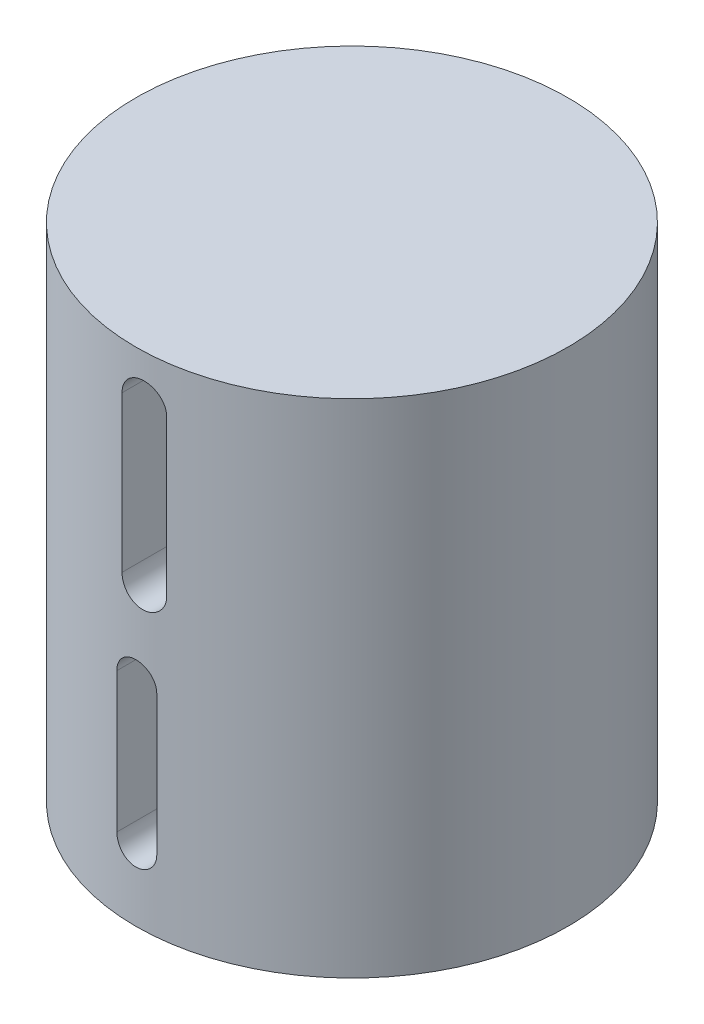
ISO-10303-21;
HEADER;
FILE_DESCRIPTION(('STEP AP214'),'2;1');
FILE_NAME('part.step','',(''),(''),'','','');
FILE_SCHEMA(('AUTOMOTIVE_DESIGN { 1 0 10303 214 1 1 1 1 }'));
ENDSEC;
DATA;
#1=APPLICATION_CONTEXT('core data for automotive mechanical design processes');
#2=APPLICATION_PROTOCOL_DEFINITION('international standard','automotive_design',2000,#1);
#3=PRODUCT_CONTEXT('',#1,'mechanical');
#4=PRODUCT('Part','Part','',(#3));
#5=PRODUCT_RELATED_PRODUCT_CATEGORY('part','',(#4));
#6=PRODUCT_DEFINITION_FORMATION('','',#4);
#7=PRODUCT_DEFINITION_CONTEXT('part definition',#1,'design');
#8=PRODUCT_DEFINITION('design','',#6,#7);
#9=PRODUCT_DEFINITION_SHAPE('','',#8);
#10=(LENGTH_UNIT() NAMED_UNIT(*) SI_UNIT(.MILLI.,.METRE.));
#11=(NAMED_UNIT(*) PLANE_ANGLE_UNIT() SI_UNIT($,.RADIAN.));
#12=(NAMED_UNIT(*) SI_UNIT($,.STERADIAN.) SOLID_ANGLE_UNIT());
#13=UNCERTAINTY_MEASURE_WITH_UNIT(LENGTH_MEASURE(1.E-05),#10,'distance_accuracy_value','');
#14=(GEOMETRIC_REPRESENTATION_CONTEXT(3) GLOBAL_UNCERTAINTY_ASSIGNED_CONTEXT((#13)) GLOBAL_UNIT_ASSIGNED_CONTEXT((#10,
#11,#12)) REPRESENTATION_CONTEXT('',''));
#15=CARTESIAN_POINT('',(0.,0.,0.));
#16=DIRECTION('',(0.,0.,1.));
#17=DIRECTION('',(1.,0.,0.));
#18=AXIS2_PLACEMENT_3D('',#15,#16,#17);
#19=CARTESIAN_POINT('',(0.,75.,0.));
#20=DIRECTION('',(0.,-1.,0.));
#21=DIRECTION('',(0.,0.,-1.));
#22=AXIS2_PLACEMENT_3D('',#19,#20,#21);
#23=CYLINDRICAL_SURFACE('',#22,27.9917167443121);
#24=CARTESIAN_POINT('',(0.,10.,0.));
#25=DIRECTION('',(0.,1.,0.));
#26=DIRECTION('',(0.,0.,1.));
#27=AXIS2_PLACEMENT_3D('',#24,#25,#26);
#28=CIRCLE('',#27,27.9917167443121);
#29=CARTESIAN_POINT('',(0.,10.,27.9917167443121));
#30=VERTEX_POINT('',#29);
#31=EDGE_CURVE('E168',#30,#30,#28,.T.);
#32=ORIENTED_EDGE('',*,*,#31,.T.);
#33=EDGE_LOOP('',(#32));
#34=FACE_BOUND('',#33,.T.);
#35=CARTESIAN_POINT('',(0.,75.,0.));
#36=DIRECTION('',(0.,1.,0.));
#37=DIRECTION('',(0.,0.,1.));
#38=AXIS2_PLACEMENT_3D('',#35,#36,#37);
#39=CIRCLE('',#38,27.9917167443121);
#40=CARTESIAN_POINT('',(0.,75.,27.9917167443121));
#41=VERTEX_POINT('',#40);
#42=EDGE_CURVE('E179',#41,#41,#39,.T.);
#43=ORIENTED_EDGE('',*,*,#42,.F.);
#44=EDGE_LOOP('',(#43));
#45=FACE_BOUND('',#44,.T.);
#46=DIRECTION('',(0.,-1.,0.));
#47=VECTOR('',#46,1.);
#48=CARTESIAN_POINT('',(3.74444909323463,75.,27.740138919659));
#49=LINE('',#48,#47);
#50=CARTESIAN_POINT('',(3.74444909323463,48.7689768012807,27.740138919659));
#51=VERTEX_POINT('',#50);
#52=CARTESIAN_POINT('',(3.74444909323463,68.9189618497664,27.740138919659));
#53=VERTEX_POINT('',#52);
#54=EDGE_CURVE('E235',#51,#53,#49,.F.);
#55=ORIENTED_EDGE('',*,*,#54,.F.);
#56=CARTESIAN_POINT('',(3.74444909323463,48.7689768012807,27.740138919659));
#57=CARTESIAN_POINT('',(3.74445704511496,48.690586694152,27.7401353553298));
#58=CARTESIAN_POINT('',(3.74115906297351,48.6122005828251,27.7405829535749));
#59=CARTESIAN_POINT('',(3.72801279331923,48.4559954293826,27.7423540357947));
#60=CARTESIAN_POINT('',(3.718165013729,48.3781763437684,27.7436774518515));
#61=CARTESIAN_POINT('',(3.69199441970586,48.2237329916517,27.7471719051829));
#62=CARTESIAN_POINT('',(3.67567840441304,48.1471075580526,27.7493420523713));
#63=CARTESIAN_POINT('',(3.63670932812287,47.9955351962483,27.7544759318598));
#64=CARTESIAN_POINT('',(3.61405630490856,47.9205882580382,27.7574396594283));
#65=CARTESIAN_POINT('',(3.53679347714831,47.6990088334775,27.7674276467308));
#66=CARTESIAN_POINT('',(3.47286488635221,47.5555496195189,27.7755508130377));
#67=CARTESIAN_POINT('',(3.32210521605897,47.2814956924615,27.7939840643445));
#68=CARTESIAN_POINT('',(3.23527586992316,47.1509000067475,27.8042939838171));
#69=CARTESIAN_POINT('',(3.04061798499218,46.9053810912363,27.8262550113233));
#70=CARTESIAN_POINT('',(2.93267976138357,46.7905452977244,27.8379129888507));
#71=CARTESIAN_POINT('',(2.69911253743942,46.5805575178088,27.8615281274606));
#72=CARTESIAN_POINT('',(2.5734806021126,46.4854088035302,27.873485337908));
#73=CARTESIAN_POINT('',(2.30727550242263,46.3169876014924,27.8967849255826));
#74=CARTESIAN_POINT('',(2.16662320976038,46.2438395833208,27.9081235180752));
#75=CARTESIAN_POINT('',(1.87491737025326,46.1222454844783,27.9292365101861));
#76=CARTESIAN_POINT('',(1.72386460217419,46.0737975565947,27.9390110267373));
#77=CARTESIAN_POINT('',(1.41599748569648,46.0031157098133,27.9563026537627));
#78=CARTESIAN_POINT('',(1.25919770164912,45.9808196913717,27.9638250801887));
#79=CARTESIAN_POINT('',(0.943976487926248,45.9629310433878,27.9762397094225));
#80=CARTESIAN_POINT('',(0.785555080084249,45.9673380547875,27.9811319475957));
#81=CARTESIAN_POINT('',(0.472561901924725,46.002667299285,27.9881629161096));
#82=CARTESIAN_POINT('',(0.317973220265818,46.0334367441357,27.9903173356476));
#83=CARTESIAN_POINT('',(0.0161176459158607,46.1204266005814,27.9921192714774));
#84=CARTESIAN_POINT('',(-0.131149327761297,46.1766467305945,27.9917668155043));
#85=CARTESIAN_POINT('',(-0.413985827927334,46.3128447082345,27.989012500326));
#86=CARTESIAN_POINT('',(-0.549570708237887,46.3927907387041,27.9866133777372));
#87=CARTESIAN_POINT('',(-0.80544403756341,46.5741993187506,27.9804194204337));
#88=CARTESIAN_POINT('',(-0.925732861137399,46.6756613412967,27.9766246199042));
#89=CARTESIAN_POINT('',(-1.14798733749326,46.8975803360231,27.9683886520502));
#90=CARTESIAN_POINT('',(-1.24989664407887,47.0180936637549,27.9639455701509));
#91=CARTESIAN_POINT('',(-1.43210504367707,47.2745467688922,27.9552076078204));
#92=CARTESIAN_POINT('',(-1.51239746944084,47.4104912873702,27.950912773468));
#93=CARTESIAN_POINT('',(-1.64922269505872,47.6942501123701,27.9431744203479));
#94=CARTESIAN_POINT('',(-1.70569832045946,47.8420919787682,27.9397329582402));
#95=CARTESIAN_POINT('',(-1.79293402362943,48.1450773651237,27.9342717022277));
#96=CARTESIAN_POINT('',(-1.82373204315013,48.3002097528485,27.932249811436));
#97=CARTESIAN_POINT('',(-1.8471141961841,48.5085248493752,27.9307069169186));
#98=CARTESIAN_POINT('',(-1.8514818170202,48.560565604589,27.9304175759835));
#99=CARTESIAN_POINT('',(-1.85729844703487,48.6647226052589,27.9300315284447));
#100=CARTESIAN_POINT('',(-1.85875237235229,48.7168385748354,27.9299344973688));
#101=CARTESIAN_POINT('',(-1.85875530527474,48.7689768012807,27.9299343896279));
#102=B_SPLINE_CURVE_WITH_KNOTS('',3,(#56,#57,#58,#59,#60,#61,#62,#63,#64,#65,#66,#67,#68,#69,
#70,#71,#72,#73,#74,#75,#76,#77,#78,#79,#80,#81,#82,#83,#84,#85,#86,#87,#88,#89,#90,#91,#92,#93,
#94,#95,#96,#97,#98,#99,#100,#101),.UNSPECIFIED.,.F.,.F.,(4,2,2,2,2,2,2,2,2,2,2,2,2,2,2,2,2,2,2,
2,2,2,4),(0.,0.235092589894027,0.470166950992361,0.704994864131157,0.939821377188532,
1.40920953691749,1.87856217878317,2.35042175105181,2.82235968666575,3.29691946485833,
3.77144374757206,4.24483894317259,4.71822777335365,5.18889140999129,5.65954983941499,
6.12957993181801,6.59959851223922,7.07103440555003,7.54261553669197,8.0153223854869,
8.48732950889387,8.64394381577868,8.8002936516146),.UNSPECIFIED.);
#103=CARTESIAN_POINT('',(-1.85875530527474,48.7689768012807,27.9299343896279));
#104=VERTEX_POINT('',#103);
#105=EDGE_CURVE('E183',#51,#104,#102,.T.);
#106=ORIENTED_EDGE('',*,*,#105,.T.);
#107=DIRECTION('',(0.,-1.,0.));
#108=VECTOR('',#107,1.);
#109=CARTESIAN_POINT('',(-1.85875530527474,75.,27.9299343896279));
#110=LINE('',#109,#108);
#111=CARTESIAN_POINT('',(-1.85875530527474,68.9189618497664,27.9299343896279));
#112=VERTEX_POINT('',#111);
#113=EDGE_CURVE('E270',#104,#112,#110,.F.);
#114=ORIENTED_EDGE('',*,*,#113,.T.);
#115=CARTESIAN_POINT('',(-1.85875530527474,68.9189618497664,27.9299343896279));
#116=CARTESIAN_POINT('',(-1.85876295782562,68.9976817319071,27.9299313963593));
#117=CARTESIAN_POINT('',(-1.85543751423861,69.0763978836444,27.9301551261291));
#118=CARTESIAN_POINT('',(-1.84217969387301,69.2332649958199,27.931034014163));
#119=CARTESIAN_POINT('',(-1.83224769897543,69.3114159886622,27.9316891474906));
#120=CARTESIAN_POINT('',(-1.80584658591295,69.4665422112448,27.9334081419953));
#121=CARTESIAN_POINT('',(-1.78938270326621,69.5435183314927,27.9344716758044));
#122=CARTESIAN_POINT('',(-1.75005261254788,69.6957881632406,27.9369630902957));
#123=CARTESIAN_POINT('',(-1.72718646828979,69.7710818915013,27.9383909673464));
#124=CARTESIAN_POINT('',(-1.64917480120353,69.993704911741,27.9431420516142));
#125=CARTESIAN_POINT('',(-1.58460355498917,70.1378490135457,27.9469336037379));
#126=CARTESIAN_POINT('',(-1.43226289445666,70.4131546035399,27.9551534951725));
#127=CARTESIAN_POINT('',(-1.34449710999089,70.5443181187284,27.9595817347949));
#128=CARTESIAN_POINT('',(-1.14806827210346,70.7902820280764,27.9683356494295));
#129=CARTESIAN_POINT('',(-1.03937501462032,70.9050583489237,27.972661165923));
#130=CARTESIAN_POINT('',(-0.804229436077997,71.1147589624343,27.9804079884813));
#131=CARTESIAN_POINT('',(-0.677774595195197,71.2096804335391,27.9838291660493));
#132=CARTESIAN_POINT('',(-0.410732321582826,71.3769304217213,27.9890211980751));
#133=CARTESIAN_POINT('',(-0.270149023726104,71.4492655236818,27.9907925338308));
#134=CARTESIAN_POINT('',(0.0211664903385995,71.5693006586729,27.9920872856739));
#135=CARTESIAN_POINT('',(0.1718978145241,71.6170028537749,27.9916108990849));
#136=CARTESIAN_POINT('',(0.478692385147026,71.6863045400177,27.9880421714769));
#137=CARTESIAN_POINT('',(0.634736408928982,71.7079895929174,27.9849584624365));
#138=CARTESIAN_POINT('',(0.948178246724546,71.7249519196815,27.9760923351332));
#139=CARTESIAN_POINT('',(1.10557607919363,71.7202288329716,27.9703098800227));
#140=CARTESIAN_POINT('',(1.4171067190129,71.6845741136679,27.9562571224414));
#141=CARTESIAN_POINT('',(1.57124245445566,71.6536671040245,27.9479891620116));
#142=CARTESIAN_POINT('',(1.87208273903648,71.5666058907593,27.92945115866));
#143=CARTESIAN_POINT('',(2.01878709060086,71.5104510162796,27.9191810625436));
#144=CARTESIAN_POINT('',(2.30135792633205,71.3741891685309,27.8973144638161));
#145=CARTESIAN_POINT('',(2.43717054051768,71.2939714529552,27.885711985053));
#146=CARTESIAN_POINT('',(2.69341862720486,71.1119445304878,27.8621299461228));
#147=CARTESIAN_POINT('',(2.81385423938309,71.0101355197424,27.850150389382));
#148=CARTESIAN_POINT('',(3.03652549777208,70.7872282165833,27.8267557983758));
#149=CARTESIAN_POINT('',(3.13867343692052,70.6660419813412,27.8153436647245));
#150=CARTESIAN_POINT('',(3.32119376017136,70.408058034765,27.7941424054596));
#151=CARTESIAN_POINT('',(3.40155974784222,70.2712557543879,27.7843537569212));
#152=CARTESIAN_POINT('',(3.53800517506345,69.9862311499804,27.7673092586728));
#153=CARTESIAN_POINT('',(3.59413020440393,69.8380308862048,27.7600486595106));
#154=CARTESIAN_POINT('',(3.68057938892478,69.5343009681011,27.7487202459453));
#155=CARTESIAN_POINT('',(3.71094376707566,69.3787831417908,27.7446474548355));
#156=CARTESIAN_POINT('',(3.73349338380904,69.1716456756817,27.7416157378937));
#157=CARTESIAN_POINT('',(3.73760376102253,69.1211537129186,27.7410621221308));
#158=CARTESIAN_POINT('',(3.74307788838984,69.020102139951,27.7403241912412));
#159=CARTESIAN_POINT('',(3.74444617161081,68.9695427798865,27.7401392666188));
#160=CARTESIAN_POINT('',(3.74444909323463,68.9189618497664,27.740138919659));
#161=B_SPLINE_CURVE_WITH_KNOTS('',3,(#115,#116,#117,#118,#119,#120,#121,#122,#123,#124,#125,
#126,#127,#128,#129,#130,#131,#132,#133,#134,#135,#136,#137,#138,#139,#140,#141,#142,#143,#144,
#145,#146,#147,#148,#149,#150,#151,#152,#153,#154,#155,#156,#157,#158,#159,#160),.UNSPECIFIED.,
.F.,.F.,(4,2,2,2,2,2,2,2,2,2,2,2,2,2,2,2,2,2,2,2,2,2,4),(0.,0.236082420592652,0.472151196009054,
0.708031135748033,0.943908724476019,1.41544457719907,1.88690668010176,2.35905440263269,
2.83126917622018,3.30334615038128,3.77538168250795,4.24586055331461,4.71634584801139,
5.18638919619959,5.65644503459177,6.12869825450951,6.60094718442005,7.07540363435024,
7.54999926134792,8.02369839160574,8.4966565142598,8.64858872863664,8.80026956981301),.UNSPECIFIED.);
#162=EDGE_CURVE('E68',#112,#53,#161,.T.);
#163=ORIENTED_EDGE('',*,*,#162,.T.);
#164=EDGE_LOOP('',(#55,#106,#114,#163));
#165=FACE_BOUND('',#164,.T.);
#166=CARTESIAN_POINT('',(2.58609433777356,37.3470601427807,27.8719988944091));
#167=CARTESIAN_POINT('',(2.5861014866477,37.4196313835746,27.8719961127913));
#168=CARTESIAN_POINT('',(2.58303962404271,37.4921991087472,27.8722822699827));
#169=CARTESIAN_POINT('',(2.57083322869297,37.6368123292812,27.8734119117347));
#170=CARTESIAN_POINT('',(2.56168908352412,37.7088578576224,27.8742553607834));
#171=CARTESIAN_POINT('',(2.53738413618984,37.8518580658277,27.876478064783));
#172=CARTESIAN_POINT('',(2.5222286231468,37.9228136478299,27.8778568486951));
#173=CARTESIAN_POINT('',(2.48602628073649,38.0631729284349,27.8811084214287));
#174=CARTESIAN_POINT('',(2.46497950312181,38.1325766406646,27.8829812059105));
#175=CARTESIAN_POINT('',(2.39318111822502,38.337779301404,27.8892674026135));
#176=CARTESIAN_POINT('',(2.33375920801805,38.4706414330029,27.8943498497962));
#177=CARTESIAN_POINT('',(2.19358580637322,38.7244152388,27.9057215865824));
#178=CARTESIAN_POINT('',(2.11283712145162,38.8453284825479,27.9120107173614));
#179=CARTESIAN_POINT('',(1.93201672436344,39.0722516118903,27.9251093953666));
#180=CARTESIAN_POINT('',(1.83189373908307,39.1782206325725,27.9319202938734));
#181=CARTESIAN_POINT('',(1.61526943541105,39.3718822444812,27.9452833872073));
#182=CARTESIAN_POINT('',(1.49876562771886,39.4595720528822,27.9518355425203));
#183=CARTESIAN_POINT('',(1.25244015440353,39.6143202012556,27.9639555355354));
#184=CARTESIAN_POINT('',(1.12259539895874,39.6813419399259,27.9695216196626));
#185=CARTESIAN_POINT('',(0.853443213952327,39.7926117209674,27.9790270351948));
#186=CARTESIAN_POINT('',(0.714136556900686,39.8368616200046,27.9829664992185));
#187=CARTESIAN_POINT('',(0.430429853141525,39.9012158028321,27.9887655905826));
#188=CARTESIAN_POINT('',(0.286045494929876,39.9213887078272,27.9906311277204));
#189=CARTESIAN_POINT('',(-0.00407446061277558,39.9372284584827,27.992092256473));
#190=CARTESIAN_POINT('',(-0.149810060733589,39.932895253536,27.9916878434002));
#191=CARTESIAN_POINT('',(-0.438022066491248,39.8999008612556,27.9886594109255));
#192=CARTESIAN_POINT('',(-0.580507081818156,39.8713141701063,27.986042188399));
#193=CARTESIAN_POINT('',(-0.858647333645727,39.7907403203251,27.978890222406));
#194=CARTESIAN_POINT('',(-0.994302526078108,39.7387530107263,27.9743554665687));
#195=CARTESIAN_POINT('',(-1.25517156278219,39.6127702067319,27.9638666324467));
#196=CARTESIAN_POINT('',(-1.38036908975522,39.5387411122437,27.957910390045));
#197=CARTESIAN_POINT('',(-1.61658444527597,39.3708038499455,27.9452477917485));
#198=CARTESIAN_POINT('',(-1.72760256047558,39.2768960841061,27.9385414510229));
#199=CARTESIAN_POINT('',(-1.93273556312799,39.071462945595,27.9251028116669));
#200=CARTESIAN_POINT('',(-2.02678806294557,38.9598752735488,27.918370506625));
#201=CARTESIAN_POINT('',(-2.19486479801599,38.722418838144,27.9056608088691));
#202=CARTESIAN_POINT('',(-2.26888290301141,38.5965457203136,27.8996836475167));
#203=CARTESIAN_POINT('',(-2.39478595901623,38.3340290085275,27.8891594839567));
#204=CARTESIAN_POINT('',(-2.44665401246071,38.1973772857286,27.8846135742973));
#205=CARTESIAN_POINT('',(-2.52661407795072,37.9173556702468,27.877483136544));
#206=CARTESIAN_POINT('',(-2.55474210259486,37.7739963027432,27.8748956382424));
#207=CARTESIAN_POINT('',(-2.57578603527063,37.5825440266925,27.8729535954458));
#208=CARTESIAN_POINT('',(-2.57965358708865,37.535489363118,27.8725958023572));
#209=CARTESIAN_POINT('',(-2.58480424195147,37.4413163596546,27.8721187499864));
#210=CARTESIAN_POINT('',(-2.58609165127455,37.3941982574247,27.8719990932551));
#211=CARTESIAN_POINT('',(-2.58609433777356,37.3470601427807,27.8719988944091));
#212=B_SPLINE_CURVE_WITH_KNOTS('',3,(#166,#167,#168,#169,#170,#171,#172,#173,#174,#175,#176,
#177,#178,#179,#180,#181,#182,#183,#184,#185,#186,#187,#188,#189,#190,#191,#192,#193,#194,#195,
#196,#197,#198,#199,#200,#201,#202,#203,#204,#205,#206,#207,#208,#209,#210,#211),.UNSPECIFIED.,
.F.,.F.,(4,2,2,2,2,2,2,2,2,2,2,2,2,2,2,2,2,2,2,2,2,2,4),(0.,0.217642300167659,0.435270733036125,
0.652708108036413,0.870143572988703,1.30479912446798,1.73939750553051,2.17516216023124,
2.61099310732688,3.04759149755516,3.48415428477837,3.9194698419071,4.35478629800032,
4.7887704715377,5.22275744492606,5.65740939697416,6.09205256067929,6.52826282670522,
6.96460641674609,7.40128228726363,7.83729454262271,7.97888767451495,8.12024428888537),.UNSPECIFIED.);
#213=CARTESIAN_POINT('',(2.58609433777356,37.3470601427807,27.8719988944091));
#214=VERTEX_POINT('',#213);
#215=CARTESIAN_POINT('',(-2.58609433777356,37.3470601427807,27.8719988944091));
#216=VERTEX_POINT('',#215);
#217=EDGE_CURVE('E11',#214,#216,#212,.T.);
#218=ORIENTED_EDGE('',*,*,#217,.F.);
#219=DIRECTION('',(0.,-1.,0.));
#220=VECTOR('',#219,1.);
#221=CARTESIAN_POINT('',(2.58609433777356,75.,27.8719988944091));
#222=LINE('',#221,#220);
#223=CARTESIAN_POINT('',(2.58609433777356,19.2443997783658,27.8719988944091));
#224=VERTEX_POINT('',#223);
#225=EDGE_CURVE('E238',#224,#214,#222,.F.);
#226=ORIENTED_EDGE('',*,*,#225,.F.);
#227=CARTESIAN_POINT('',(-2.58609433777356,19.2443997783658,27.8719988944091));
#228=CARTESIAN_POINT('',(-2.5861014866477,19.1718285375719,27.8719961127913));
#229=CARTESIAN_POINT('',(-2.58303962404271,19.0992608123993,27.8722822699827));
#230=CARTESIAN_POINT('',(-2.57083322869297,18.9546475918653,27.8734119117347));
#231=CARTESIAN_POINT('',(-2.56168908352412,18.8826020635241,27.8742553607834));
#232=CARTESIAN_POINT('',(-2.53738413618984,18.7396018553188,27.876478064783));
#233=CARTESIAN_POINT('',(-2.5222286231468,18.6686462733166,27.8778568486951));
#234=CARTESIAN_POINT('',(-2.48602628073648,18.5282869927115,27.8811084214287));
#235=CARTESIAN_POINT('',(-2.46497950312181,18.4588832804819,27.8829812059105));
#236=CARTESIAN_POINT('',(-2.39318111822501,18.2536806197425,27.8892674026135));
#237=CARTESIAN_POINT('',(-2.33375920801805,18.1208184881435,27.8943498497962));
#238=CARTESIAN_POINT('',(-2.19358580637321,17.8670446823465,27.9057215865824));
#239=CARTESIAN_POINT('',(-2.11283712145162,17.7461314385985,27.9120107173614));
#240=CARTESIAN_POINT('',(-1.93201672436344,17.5192083092561,27.9251093953666));
#241=CARTESIAN_POINT('',(-1.83189373908307,17.4132392885739,27.9319202938734));
#242=CARTESIAN_POINT('',(-1.61526943541105,17.2195776766653,27.9452833872073));
#243=CARTESIAN_POINT('',(-1.49876562771886,17.1318878682642,27.9518355425203));
#244=CARTESIAN_POINT('',(-1.25244015440353,16.9771397198908,27.9639555355354));
#245=CARTESIAN_POINT('',(-1.12259539895874,16.9101179812205,27.9695216196626));
#246=CARTESIAN_POINT('',(-0.853443213952327,16.7988482001791,27.9790270351948));
#247=CARTESIAN_POINT('',(-0.714136556900685,16.7545983011418,27.9829664992185));
#248=CARTESIAN_POINT('',(-0.430429853141522,16.6902441183144,27.9887655905826));
#249=CARTESIAN_POINT('',(-0.286045494929873,16.6700712133193,27.9906311277204));
#250=CARTESIAN_POINT('',(0.00407446061277824,16.6542314626637,27.992092256473));
#251=CARTESIAN_POINT('',(0.149810060733592,16.6585646676105,27.9916878434002));
#252=CARTESIAN_POINT('',(0.438022066491251,16.6915590598909,27.9886594109255));
#253=CARTESIAN_POINT('',(0.580507081818158,16.7201457510402,27.986042188399));
#254=CARTESIAN_POINT('',(0.858647333645729,16.8007196008213,27.978890222406));
#255=CARTESIAN_POINT('',(0.994302526078111,16.8527069104201,27.9743554665687));
#256=CARTESIAN_POINT('',(1.25517156278219,16.9786897144146,27.9638666324467));
#257=CARTESIAN_POINT('',(1.38036908975522,17.0527188089028,27.957910390045));
#258=CARTESIAN_POINT('',(1.61658444527597,17.220656071201,27.9452477917485));
#259=CARTESIAN_POINT('',(1.72760256047558,17.3145638370404,27.9385414510229));
#260=CARTESIAN_POINT('',(1.93273556312799,17.5199969755514,27.9251028116669));
#261=CARTESIAN_POINT('',(2.02678806294557,17.6315846475977,27.918370506625));
#262=CARTESIAN_POINT('',(2.19486479801599,17.8690410830025,27.9056608088691));
#263=CARTESIAN_POINT('',(2.26888290301141,17.9949142008328,27.8996836475166));
#264=CARTESIAN_POINT('',(2.39478595901624,18.257430912619,27.8891594839567));
#265=CARTESIAN_POINT('',(2.44665401246071,18.3940826354179,27.8846135742973));
#266=CARTESIAN_POINT('',(2.52661407795072,18.6741042508997,27.877483136544));
#267=CARTESIAN_POINT('',(2.55474210259486,18.8174636184033,27.8748956382424));
#268=CARTESIAN_POINT('',(2.57578603527063,19.008915894454,27.8729535954458));
#269=CARTESIAN_POINT('',(2.57965358708865,19.0559705580284,27.8725958023572));
#270=CARTESIAN_POINT('',(2.58480424195147,19.1501435614919,27.8721187499864));
#271=CARTESIAN_POINT('',(2.58609165127455,19.1972616637218,27.8719990932551));
#272=CARTESIAN_POINT('',(2.58609433777356,19.2443997783658,27.8719988944091));
#273=B_SPLINE_CURVE_WITH_KNOTS('',3,(#227,#228,#229,#230,#231,#232,#233,#234,#235,#236,#237,
#238,#239,#240,#241,#242,#243,#244,#245,#246,#247,#248,#249,#250,#251,#252,#253,#254,#255,#256,
#257,#258,#259,#260,#261,#262,#263,#264,#265,#266,#267,#268,#269,#270,#271,#272),.UNSPECIFIED.,
.F.,.F.,(4,2,2,2,2,2,2,2,2,2,2,2,2,2,2,2,2,2,2,2,2,2,4),(0.,0.217642300167659,0.435270733036132,
0.652708108036427,0.870143572988707,1.30479912446799,1.73939750553052,2.17516216023124,
2.61099310732688,3.04759149755516,3.48415428477837,3.9194698419071,4.35478629800032,
4.78877047153771,5.22275744492606,5.65740939697416,6.0920525606793,6.52826282670522,
6.96460641674609,7.40128228726365,7.83729454262272,7.97888767451496,8.12024428888537),.UNSPECIFIED.);
#274=CARTESIAN_POINT('',(-2.58609433777356,19.2443997783658,27.8719988944091));
#275=VERTEX_POINT('',#274);
#276=EDGE_CURVE('E239',#275,#224,#273,.T.);
#277=ORIENTED_EDGE('',*,*,#276,.F.);
#278=DIRECTION('',(0.,-1.,0.));
#279=VECTOR('',#278,1.);
#280=CARTESIAN_POINT('',(-2.58609433777356,75.,27.8719988944091));
#281=LINE('',#280,#279);
#282=EDGE_CURVE('E53',#216,#275,#281,.T.);
#283=ORIENTED_EDGE('',*,*,#282,.F.);
#284=EDGE_LOOP('',(#218,#226,#277,#283));
#285=FACE_BOUND('',#284,.T.);
#286=ADVANCED_FACE('F39',(#34,#45,#165,#285),#23,.T.);
#287=CARTESIAN_POINT('',(0.,75.,0.));
#288=DIRECTION('',(0.,1.,0.));
#289=DIRECTION('',(0.,0.,1.));
#290=AXIS2_PLACEMENT_3D('',#287,#288,#289);
#291=PLANE('',#290);
#292=ORIENTED_EDGE('',*,*,#42,.T.);
#293=EDGE_LOOP('',(#292));
#294=FACE_BOUND('',#293,.T.);
#295=ADVANCED_FACE('F218',(#294),#291,.T.);
#296=CARTESIAN_POINT('',(0.,10.,0.));
#297=DIRECTION('',(0.,1.,0.));
#298=DIRECTION('',(0.,0.,1.));
#299=AXIS2_PLACEMENT_3D('',#296,#297,#298);
#300=PLANE('',#299);
#301=ORIENTED_EDGE('',*,*,#31,.F.);
#302=EDGE_LOOP('',(#301));
#303=FACE_BOUND('',#302,.T.);
#304=ADVANCED_FACE('F217',(#303),#300,.F.);
#305=CARTESIAN_POINT('',(0.942846893979946,68.9189618497664,0.99171674431215));
#306=DIRECTION('',(0.,0.,1.));
#307=DIRECTION('',(1.,0.,0.));
#308=AXIS2_PLACEMENT_3D('',#305,#306,#307);
#309=CYLINDRICAL_SURFACE('',#308,2.80160219925468);
#310=DIRECTION('',(0.,0.,1.));
#311=VECTOR('',#310,1.);
#312=CARTESIAN_POINT('',(-1.85875530527474,68.9189618497664,0.99171674431215));
#313=LINE('',#312,#311);
#314=CARTESIAN_POINT('',(-1.85875530527474,68.9189618497664,0.99171674431215));
#315=VERTEX_POINT('',#314);
#316=EDGE_CURVE('E164',#315,#112,#313,.T.);
#317=ORIENTED_EDGE('',*,*,#316,.F.);
#318=CARTESIAN_POINT('',(0.942846893979946,68.9189618497664,0.99171674431215));
#319=DIRECTION('',(0.,0.,1.));
#320=DIRECTION('',(1.,0.,0.));
#321=AXIS2_PLACEMENT_3D('',#318,#319,#320);
#322=CIRCLE('',#321,2.80160219925468);
#323=CARTESIAN_POINT('',(3.74444909323463,68.9189618497664,0.99171674431215));
#324=VERTEX_POINT('',#323);
#325=EDGE_CURVE('E120',#324,#315,#322,.T.);
#326=ORIENTED_EDGE('',*,*,#325,.F.);
#327=DIRECTION('',(0.,0.,1.));
#328=VECTOR('',#327,1.);
#329=CARTESIAN_POINT('',(3.74444909323463,68.9189618497664,0.99171674431215));
#330=LINE('',#329,#328);
#331=EDGE_CURVE('E165',#324,#53,#330,.T.);
#332=ORIENTED_EDGE('',*,*,#331,.T.);
#333=ORIENTED_EDGE('',*,*,#162,.F.);
#334=EDGE_LOOP('',(#317,#326,#332,#333));
#335=FACE_BOUND('',#334,.T.);
#336=ADVANCED_FACE('F213',(#335),#309,.F.);
#337=CARTESIAN_POINT('',(3.74444909323463,68.9189618497664,0.99171674431215));
#338=DIRECTION('',(-1.,0.,0.));
#339=DIRECTION('',(0.,0.,1.));
#340=AXIS2_PLACEMENT_3D('',#337,#338,#339);
#341=PLANE('',#340);
#342=ORIENTED_EDGE('',*,*,#54,.T.);
#343=ORIENTED_EDGE('',*,*,#331,.F.);
#344=DIRECTION('',(0.,-1.,0.));
#345=VECTOR('',#344,1.);
#346=CARTESIAN_POINT('',(3.74444909323463,68.9189618497664,0.99171674431215));
#347=LINE('',#346,#345);
#348=CARTESIAN_POINT('',(3.74444909323463,48.7689768012807,0.99171674431215));
#349=VERTEX_POINT('',#348);
#350=EDGE_CURVE('E161',#324,#349,#347,.T.);
#351=ORIENTED_EDGE('',*,*,#350,.T.);
#352=DIRECTION('',(0.,0.,1.));
#353=VECTOR('',#352,1.);
#354=CARTESIAN_POINT('',(3.74444909323463,48.7689768012807,0.99171674431215));
#355=LINE('',#354,#353);
#356=EDGE_CURVE('E169',#349,#51,#355,.T.);
#357=ORIENTED_EDGE('',*,*,#356,.T.);
#358=EDGE_LOOP('',(#342,#343,#351,#357));
#359=FACE_BOUND('',#358,.T.);
#360=ADVANCED_FACE('F207',(#359),#341,.T.);
#361=CARTESIAN_POINT('',(0.942846893979946,48.7689768012807,0.99171674431215));
#362=DIRECTION('',(0.,0.,1.));
#363=DIRECTION('',(1.,0.,0.));
#364=AXIS2_PLACEMENT_3D('',#361,#362,#363);
#365=CYLINDRICAL_SURFACE('',#364,2.80160219925468);
#366=ORIENTED_EDGE('',*,*,#356,.F.);
#367=CARTESIAN_POINT('',(0.942846893979946,48.7689768012807,0.99171674431215));
#368=DIRECTION('',(0.,0.,1.));
#369=DIRECTION('',(1.,0.,0.));
#370=AXIS2_PLACEMENT_3D('',#367,#368,#369);
#371=CIRCLE('',#370,2.80160219925468);
#372=CARTESIAN_POINT('',(-1.85875530527474,48.7689768012807,0.99171674431215));
#373=VERTEX_POINT('',#372);
#374=EDGE_CURVE('E157',#373,#349,#371,.T.);
#375=ORIENTED_EDGE('',*,*,#374,.F.);
#376=DIRECTION('',(0.,0.,1.));
#377=VECTOR('',#376,1.);
#378=CARTESIAN_POINT('',(-1.85875530527474,48.7689768012807,0.99171674431215));
#379=LINE('',#378,#377);
#380=EDGE_CURVE('E173',#373,#104,#379,.T.);
#381=ORIENTED_EDGE('',*,*,#380,.T.);
#382=ORIENTED_EDGE('',*,*,#105,.F.);
#383=EDGE_LOOP('',(#366,#375,#381,#382));
#384=FACE_BOUND('',#383,.T.);
#385=ADVANCED_FACE('F201',(#384),#365,.F.);
#386=CARTESIAN_POINT('',(-1.85875530527474,68.9189618497664,0.99171674431215));
#387=DIRECTION('',(-1.,0.,0.));
#388=DIRECTION('',(0.,0.,1.));
#389=AXIS2_PLACEMENT_3D('',#386,#387,#388);
#390=PLANE('',#389);
#391=ORIENTED_EDGE('',*,*,#380,.F.);
#392=DIRECTION('',(0.,-1.,0.));
#393=VECTOR('',#392,1.);
#394=CARTESIAN_POINT('',(-1.85875530527474,68.9189618497664,0.99171674431215));
#395=LINE('',#394,#393);
#396=EDGE_CURVE('E153',#315,#373,#395,.T.);
#397=ORIENTED_EDGE('',*,*,#396,.F.);
#398=ORIENTED_EDGE('',*,*,#316,.T.);
#399=ORIENTED_EDGE('',*,*,#113,.F.);
#400=EDGE_LOOP('',(#391,#397,#398,#399));
#401=FACE_BOUND('',#400,.T.);
#402=ADVANCED_FACE('F206',(#401),#390,.F.);
#403=CARTESIAN_POINT('',(0.942846893979946,68.9189618497664,0.99171674431215));
#404=DIRECTION('',(0.,0.,1.));
#405=DIRECTION('',(1.,0.,0.));
#406=AXIS2_PLACEMENT_3D('',#403,#404,#405);
#407=PLANE('',#406);
#408=ORIENTED_EDGE('',*,*,#325,.T.);
#409=ORIENTED_EDGE('',*,*,#396,.T.);
#410=ORIENTED_EDGE('',*,*,#374,.T.);
#411=ORIENTED_EDGE('',*,*,#350,.F.);
#412=EDGE_LOOP('',(#408,#409,#410,#411));
#413=FACE_BOUND('',#412,.T.);
#414=ADVANCED_FACE('F211',(#413),#407,.T.);
#415=CARTESIAN_POINT('',(0.,37.3470601427807,50.));
#416=DIRECTION('',(0.,0.,-1.));
#417=DIRECTION('',(-1.,0.,0.));
#418=AXIS2_PLACEMENT_3D('',#415,#416,#417);
#419=CYLINDRICAL_SURFACE('',#418,2.58609433777356);
#420=ORIENTED_EDGE('',*,*,#217,.T.);
#421=DIRECTION('',(0.,0.,-1.));
#422=VECTOR('',#421,1.);
#423=CARTESIAN_POINT('',(-2.58609433777356,37.3470601427807,50.));
#424=LINE('',#423,#422);
#425=CARTESIAN_POINT('',(-2.58609433777356,37.3470601427807,0.));
#426=VERTEX_POINT('',#425);
#427=EDGE_CURVE('E110',#216,#426,#424,.T.);
#428=ORIENTED_EDGE('',*,*,#427,.T.);
#429=CARTESIAN_POINT('',(0.,37.3470601427807,0.));
#430=DIRECTION('',(0.,0.,1.));
#431=DIRECTION('',(1.,0.,0.));
#432=AXIS2_PLACEMENT_3D('',#429,#430,#431);
#433=CIRCLE('',#432,2.58609433777356);
#434=CARTESIAN_POINT('',(2.58609433777356,37.3470601427807,0.));
#435=VERTEX_POINT('',#434);
#436=EDGE_CURVE('E115',#435,#426,#433,.T.);
#437=ORIENTED_EDGE('',*,*,#436,.F.);
#438=DIRECTION('',(0.,0.,-1.));
#439=VECTOR('',#438,1.);
#440=CARTESIAN_POINT('',(2.58609433777356,37.3470601427807,50.));
#441=LINE('',#440,#439);
#442=EDGE_CURVE('E143',#214,#435,#441,.T.);
#443=ORIENTED_EDGE('',*,*,#442,.F.);
#444=EDGE_LOOP('',(#420,#428,#437,#443));
#445=FACE_BOUND('',#444,.T.);
#446=ADVANCED_FACE('F112',(#445),#419,.F.);
#447=CARTESIAN_POINT('',(-2.58609433777356,37.3470601427807,50.));
#448=DIRECTION('',(1.,0.,0.));
#449=DIRECTION('',(0.,0.,-1.));
#450=AXIS2_PLACEMENT_3D('',#447,#448,#449);
#451=PLANE('',#450);
#452=ORIENTED_EDGE('',*,*,#282,.T.);
#453=DIRECTION('',(0.,0.,-1.));
#454=VECTOR('',#453,1.);
#455=CARTESIAN_POINT('',(-2.58609433777356,19.2443997783658,50.));
#456=LINE('',#455,#454);
#457=CARTESIAN_POINT('',(-2.58609433777356,19.2443997783658,0.));
#458=VERTEX_POINT('',#457);
#459=EDGE_CURVE('E121',#275,#458,#456,.T.);
#460=ORIENTED_EDGE('',*,*,#459,.T.);
#461=DIRECTION('',(0.,-1.,0.));
#462=VECTOR('',#461,1.);
#463=CARTESIAN_POINT('',(-2.58609433777356,37.3470601427807,0.));
#464=LINE('',#463,#462);
#465=EDGE_CURVE('E124',#426,#458,#464,.T.);
#466=ORIENTED_EDGE('',*,*,#465,.F.);
#467=ORIENTED_EDGE('',*,*,#427,.F.);
#468=EDGE_LOOP('',(#452,#460,#466,#467));
#469=FACE_BOUND('',#468,.T.);
#470=ADVANCED_FACE('F125',(#469),#451,.T.);
#471=CARTESIAN_POINT('',(0.,19.2443997783658,50.));
#472=DIRECTION('',(0.,0.,-1.));
#473=DIRECTION('',(-1.,0.,0.));
#474=AXIS2_PLACEMENT_3D('',#471,#472,#473);
#475=CYLINDRICAL_SURFACE('',#474,2.58609433777356);
#476=ORIENTED_EDGE('',*,*,#276,.T.);
#477=DIRECTION('',(0.,0.,-1.));
#478=VECTOR('',#477,1.);
#479=CARTESIAN_POINT('',(2.58609433777356,19.2443997783658,50.));
#480=LINE('',#479,#478);
#481=CARTESIAN_POINT('',(2.58609433777356,19.2443997783658,0.));
#482=VERTEX_POINT('',#481);
#483=EDGE_CURVE('E60',#224,#482,#480,.T.);
#484=ORIENTED_EDGE('',*,*,#483,.T.);
#485=CARTESIAN_POINT('',(0.,19.2443997783658,0.));
#486=DIRECTION('',(0.,0.,1.));
#487=DIRECTION('',(1.,0.,0.));
#488=AXIS2_PLACEMENT_3D('',#485,#486,#487);
#489=CIRCLE('',#488,2.58609433777356);
#490=EDGE_CURVE('E131',#458,#482,#489,.T.);
#491=ORIENTED_EDGE('',*,*,#490,.F.);
#492=ORIENTED_EDGE('',*,*,#459,.F.);
#493=EDGE_LOOP('',(#476,#484,#491,#492));
#494=FACE_BOUND('',#493,.T.);
#495=ADVANCED_FACE('F250',(#494),#475,.F.);
#496=CARTESIAN_POINT('',(2.58609433777356,37.3470601427807,50.));
#497=DIRECTION('',(-1.,0.,0.));
#498=DIRECTION('',(0.,0.,1.));
#499=AXIS2_PLACEMENT_3D('',#496,#497,#498);
#500=PLANE('',#499);
#501=ORIENTED_EDGE('',*,*,#225,.T.);
#502=ORIENTED_EDGE('',*,*,#442,.T.);
#503=DIRECTION('',(0.,1.,0.));
#504=VECTOR('',#503,1.);
#505=CARTESIAN_POINT('',(2.58609433777356,37.3470601427807,0.));
#506=LINE('',#505,#504);
#507=EDGE_CURVE('E135',#482,#435,#506,.T.);
#508=ORIENTED_EDGE('',*,*,#507,.F.);
#509=ORIENTED_EDGE('',*,*,#483,.F.);
#510=EDGE_LOOP('',(#501,#502,#508,#509));
#511=FACE_BOUND('',#510,.T.);
#512=ADVANCED_FACE('F255',(#511),#500,.T.);
#513=CARTESIAN_POINT('',(0.,37.3470601427807,0.));
#514=DIRECTION('',(0.,0.,1.));
#515=DIRECTION('',(1.,0.,0.));
#516=AXIS2_PLACEMENT_3D('',#513,#514,#515);
#517=PLANE('',#516);
#518=ORIENTED_EDGE('',*,*,#436,.T.);
#519=ORIENTED_EDGE('',*,*,#465,.T.);
#520=ORIENTED_EDGE('',*,*,#490,.T.);
#521=ORIENTED_EDGE('',*,*,#507,.T.);
#522=EDGE_LOOP('',(#518,#519,#520,#521));
#523=FACE_BOUND('',#522,.T.);
#524=ADVANCED_FACE('F134',(#523),#517,.T.);
#525=CLOSED_SHELL('',(#286,#295,#304,#336,#360,#385,#402,#414,#446,#470,#495,#512,#524));
#526=MANIFOLD_SOLID_BREP('B2',#525);
#527=ADVANCED_BREP_SHAPE_REPRESENTATION('',(#18,#526),#14);
#528=SHAPE_DEFINITION_REPRESENTATION(#9,#527);
ENDSEC;
END-ISO-10303-21;
